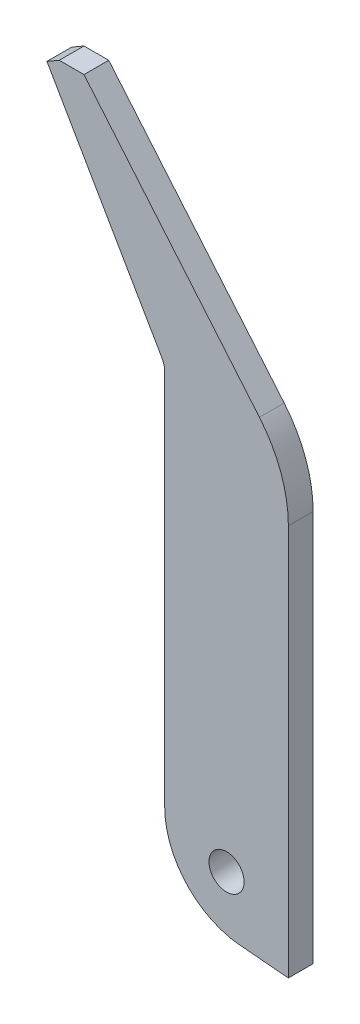
ISO-10303-21;
HEADER;
FILE_DESCRIPTION(('STEP AP214'),'2;1');
FILE_NAME('part.step','',(''),(''),'','','');
FILE_SCHEMA(('AUTOMOTIVE_DESIGN { 1 0 10303 214 1 1 1 1 }'));
ENDSEC;
DATA;
#1=APPLICATION_CONTEXT('core data for automotive mechanical design processes');
#2=APPLICATION_PROTOCOL_DEFINITION('international standard','automotive_design',2000,#1);
#3=PRODUCT_CONTEXT('',#1,'mechanical');
#4=PRODUCT('Part','Part','',(#3));
#5=PRODUCT_RELATED_PRODUCT_CATEGORY('part','',(#4));
#6=PRODUCT_DEFINITION_FORMATION('','',#4);
#7=PRODUCT_DEFINITION_CONTEXT('part definition',#1,'design');
#8=PRODUCT_DEFINITION('design','',#6,#7);
#9=PRODUCT_DEFINITION_SHAPE('','',#8);
#10=(LENGTH_UNIT() NAMED_UNIT(*) SI_UNIT(.MILLI.,.METRE.));
#11=(NAMED_UNIT(*) PLANE_ANGLE_UNIT() SI_UNIT($,.RADIAN.));
#12=(NAMED_UNIT(*) SI_UNIT($,.STERADIAN.) SOLID_ANGLE_UNIT());
#13=UNCERTAINTY_MEASURE_WITH_UNIT(LENGTH_MEASURE(1.E-05),#10,'distance_accuracy_value','');
#14=(GEOMETRIC_REPRESENTATION_CONTEXT(3) GLOBAL_UNCERTAINTY_ASSIGNED_CONTEXT((#13)) GLOBAL_UNIT_ASSIGNED_CONTEXT((#10,
#11,#12)) REPRESENTATION_CONTEXT('',''));
#15=CARTESIAN_POINT('',(0.,0.,0.));
#16=DIRECTION('',(0.,0.,1.));
#17=DIRECTION('',(1.,0.,0.));
#18=AXIS2_PLACEMENT_3D('',#15,#16,#17);
#19=CARTESIAN_POINT('',(-30.,95.,3.));
#20=DIRECTION('',(0.,0.,1.));
#21=DIRECTION('',(1.,0.,0.));
#22=AXIS2_PLACEMENT_3D('',#19,#20,#21);
#23=PLANE('',#22);
#24=DIRECTION('',(0.,-1.,0.));
#25=VECTOR('',#24,1.);
#26=CARTESIAN_POINT('',(-30.,112.43527488619,3.));
#27=LINE('',#26,#25);
#28=CARTESIAN_POINT('',(-30.,112.43527488619,3.));
#29=VERTEX_POINT('',#28);
#30=CARTESIAN_POINT('',(-30.,20.9512833861262,3.));
#31=VERTEX_POINT('',#30);
#32=EDGE_CURVE('E158',#29,#31,#27,.T.);
#33=ORIENTED_EDGE('',*,*,#32,.T.);
#34=CARTESIAN_POINT('',(-9.99999999999999,20.9512833861262,3.));
#35=DIRECTION('',(0.,0.,1.));
#36=DIRECTION('',(1.,0.,0.));
#37=AXIS2_PLACEMENT_3D('',#34,#35,#36);
#38=CIRCLE('',#37,20.);
#39=CARTESIAN_POINT('',(-11.7431148549532,1.02738942429131,3.));
#40=VERTEX_POINT('',#39);
#41=EDGE_CURVE('E11',#31,#40,#38,.T.);
#42=ORIENTED_EDGE('',*,*,#41,.T.);
#43=DIRECTION('',(0.996194698091745,-0.087155742747662,0.));
#44=VECTOR('',#43,1.);
#45=CARTESIAN_POINT('',(-30.,2.62465990577784,3.));
#46=LINE('',#45,#44);
#47=CARTESIAN_POINT('',(0.,0.,3.));
#48=VERTEX_POINT('',#47);
#49=EDGE_CURVE('E110',#40,#48,#46,.T.);
#50=ORIENTED_EDGE('',*,*,#49,.T.);
#51=DIRECTION('',(0.,1.,0.));
#52=VECTOR('',#51,1.);
#53=CARTESIAN_POINT('',(0.,0.,3.));
#54=LINE('',#53,#52);
#55=CARTESIAN_POINT('',(0.,95.,3.));
#56=VERTEX_POINT('',#55);
#57=EDGE_CURVE('E113',#48,#56,#54,.T.);
#58=ORIENTED_EDGE('',*,*,#57,.T.);
#59=CARTESIAN_POINT('',(-30.,95.,3.));
#60=DIRECTION('',(0.,0.,1.));
#61=DIRECTION('',(1.,0.,0.));
#62=AXIS2_PLACEMENT_3D('',#59,#60,#61);
#63=CIRCLE('',#62,30.);
#64=CARTESIAN_POINT('',(-7.0186667064307,114.283628290596,3.));
#65=VERTEX_POINT('',#64);
#66=EDGE_CURVE('E129',#56,#65,#63,.T.);
#67=ORIENTED_EDGE('',*,*,#66,.T.);
#68=DIRECTION('',(-0.642787609686541,0.766044443118977,0.));
#69=VECTOR('',#68,1.);
#70=CARTESIAN_POINT('',(-7.0186667064307,114.283628290596,3.));
#71=LINE('',#70,#69);
#72=CARTESIAN_POINT('',(-49.5747555024414,165.,3.));
#73=VERTEX_POINT('',#72);
#74=EDGE_CURVE('E185',#65,#73,#71,.T.);
#75=ORIENTED_EDGE('',*,*,#74,.T.);
#76=DIRECTION('',(-1.,0.,0.));
#77=VECTOR('',#76,1.);
#78=CARTESIAN_POINT('',(-49.5747555024414,165.,3.));
#79=LINE('',#78,#77);
#80=CARTESIAN_POINT('',(-55.5747555024414,165.,3.));
#81=VERTEX_POINT('',#80);
#82=EDGE_CURVE('E183',#73,#81,#79,.T.);
#83=ORIENTED_EDGE('',*,*,#82,.T.);
#84=DIRECTION('',(-0.866025403784429,-0.500000000000017,0.));
#85=VECTOR('',#84,1.);
#86=CARTESIAN_POINT('',(-55.5747555024414,165.,3.));
#87=LINE('',#86,#85);
#88=CARTESIAN_POINT('',(-58.5747555024414,163.267949192431,3.));
#89=VERTEX_POINT('',#88);
#90=EDGE_CURVE('E181',#81,#89,#87,.T.);
#91=ORIENTED_EDGE('',*,*,#90,.T.);
#92=DIRECTION('',(0.500000000000008,-0.866025403784434,0.));
#93=VECTOR('',#92,1.);
#94=CARTESIAN_POINT('',(-58.5747555024414,163.267949192431,3.));
#95=LINE('',#94,#93);
#96=CARTESIAN_POINT('',(-30.6698729810778,114.93527488619,3.));
#97=VERTEX_POINT('',#96);
#98=EDGE_CURVE('E179',#89,#97,#95,.T.);
#99=ORIENTED_EDGE('',*,*,#98,.T.);
#100=CARTESIAN_POINT('',(-35.,112.43527488619,3.));
#101=DIRECTION('',(0.,0.,-1.));
#102=DIRECTION('',(-1.,0.,0.));
#103=AXIS2_PLACEMENT_3D('',#100,#101,#102);
#104=CIRCLE('',#103,5.);
#105=EDGE_CURVE('E177',#97,#29,#104,.T.);
#106=ORIENTED_EDGE('',*,*,#105,.T.);
#107=EDGE_LOOP('',(#33,#42,#50,#58,#67,#75,#83,#91,#99,#106));
#108=FACE_BOUND('',#107,.T.);
#109=CARTESIAN_POINT('',(-15.,14.8,3.));
#110=DIRECTION('',(0.,0.,1.));
#111=DIRECTION('',(1.,0.,0.));
#112=AXIS2_PLACEMENT_3D('',#109,#110,#111);
#113=CIRCLE('',#112,4.25);
#114=CARTESIAN_POINT('',(-19.25,14.8,3.));
#115=VERTEX_POINT('',#114);
#116=EDGE_CURVE('E175',#115,#115,#113,.T.);
#117=ORIENTED_EDGE('',*,*,#116,.F.);
#118=EDGE_LOOP('',(#117));
#119=FACE_BOUND('',#118,.T.);
#120=ADVANCED_FACE('F34',(#108,#119),#23,.T.);
#121=CARTESIAN_POINT('',(-30.,95.,-3.));
#122=DIRECTION('',(0.,0.,1.));
#123=DIRECTION('',(1.,0.,0.));
#124=AXIS2_PLACEMENT_3D('',#121,#122,#123);
#125=PLANE('',#124);
#126=DIRECTION('',(0.996194698091745,-0.087155742747662,0.));
#127=VECTOR('',#126,1.);
#128=CARTESIAN_POINT('',(-30.,2.62465990577784,-3.));
#129=LINE('',#128,#127);
#130=CARTESIAN_POINT('',(-11.7431148549532,1.02738942429131,-3.));
#131=VERTEX_POINT('',#130);
#132=CARTESIAN_POINT('',(0.,0.,-3.));
#133=VERTEX_POINT('',#132);
#134=EDGE_CURVE('E132',#131,#133,#129,.T.);
#135=ORIENTED_EDGE('',*,*,#134,.F.);
#136=CARTESIAN_POINT('',(-9.99999999999999,20.9512833861262,-3.));
#137=DIRECTION('',(0.,0.,1.));
#138=DIRECTION('',(1.,0.,0.));
#139=AXIS2_PLACEMENT_3D('',#136,#137,#138);
#140=CIRCLE('',#139,20.);
#141=CARTESIAN_POINT('',(-30.,20.9512833861262,-3.));
#142=VERTEX_POINT('',#141);
#143=EDGE_CURVE('E56',#131,#142,#140,.F.);
#144=ORIENTED_EDGE('',*,*,#143,.T.);
#145=DIRECTION('',(0.,-1.,0.));
#146=VECTOR('',#145,1.);
#147=CARTESIAN_POINT('',(-30.,112.43527488619,-3.));
#148=LINE('',#147,#146);
#149=CARTESIAN_POINT('',(-30.,112.43527488619,-3.));
#150=VERTEX_POINT('',#149);
#151=EDGE_CURVE('E120',#150,#142,#148,.T.);
#152=ORIENTED_EDGE('',*,*,#151,.F.);
#153=CARTESIAN_POINT('',(-35.,112.43527488619,-3.));
#154=DIRECTION('',(0.,0.,-1.));
#155=DIRECTION('',(-1.,0.,0.));
#156=AXIS2_PLACEMENT_3D('',#153,#154,#155);
#157=CIRCLE('',#156,5.);
#158=CARTESIAN_POINT('',(-30.6698729810778,114.93527488619,-3.));
#159=VERTEX_POINT('',#158);
#160=EDGE_CURVE('E160',#159,#150,#157,.T.);
#161=ORIENTED_EDGE('',*,*,#160,.F.);
#162=DIRECTION('',(0.500000000000008,-0.866025403784434,0.));
#163=VECTOR('',#162,1.);
#164=CARTESIAN_POINT('',(-58.5747555024414,163.267949192431,-3.));
#165=LINE('',#164,#163);
#166=CARTESIAN_POINT('',(-58.5747555024414,163.267949192431,-3.));
#167=VERTEX_POINT('',#166);
#168=EDGE_CURVE('E162',#167,#159,#165,.T.);
#169=ORIENTED_EDGE('',*,*,#168,.F.);
#170=DIRECTION('',(-0.866025403784429,-0.500000000000017,0.));
#171=VECTOR('',#170,1.);
#172=CARTESIAN_POINT('',(-55.5747555024414,165.,-3.));
#173=LINE('',#172,#171);
#174=CARTESIAN_POINT('',(-55.5747555024414,165.,-3.));
#175=VERTEX_POINT('',#174);
#176=EDGE_CURVE('E164',#175,#167,#173,.T.);
#177=ORIENTED_EDGE('',*,*,#176,.F.);
#178=DIRECTION('',(-1.,0.,0.));
#179=VECTOR('',#178,1.);
#180=CARTESIAN_POINT('',(-49.5747555024414,165.,-3.));
#181=LINE('',#180,#179);
#182=CARTESIAN_POINT('',(-49.5747555024414,165.,-3.));
#183=VERTEX_POINT('',#182);
#184=EDGE_CURVE('E166',#183,#175,#181,.T.);
#185=ORIENTED_EDGE('',*,*,#184,.F.);
#186=DIRECTION('',(-0.642787609686541,0.766044443118977,0.));
#187=VECTOR('',#186,1.);
#188=CARTESIAN_POINT('',(-7.0186667064307,114.283628290596,-3.));
#189=LINE('',#188,#187);
#190=CARTESIAN_POINT('',(-7.0186667064307,114.283628290596,-3.));
#191=VERTEX_POINT('',#190);
#192=EDGE_CURVE('E168',#191,#183,#189,.T.);
#193=ORIENTED_EDGE('',*,*,#192,.F.);
#194=CARTESIAN_POINT('',(-30.,95.,-3.));
#195=DIRECTION('',(0.,0.,1.));
#196=DIRECTION('',(1.,0.,0.));
#197=AXIS2_PLACEMENT_3D('',#194,#195,#196);
#198=CIRCLE('',#197,30.);
#199=CARTESIAN_POINT('',(0.,95.,-3.));
#200=VERTEX_POINT('',#199);
#201=EDGE_CURVE('E170',#200,#191,#198,.T.);
#202=ORIENTED_EDGE('',*,*,#201,.F.);
#203=DIRECTION('',(0.,1.,0.));
#204=VECTOR('',#203,1.);
#205=CARTESIAN_POINT('',(0.,0.,-3.));
#206=LINE('',#205,#204);
#207=EDGE_CURVE('E172',#133,#200,#206,.T.);
#208=ORIENTED_EDGE('',*,*,#207,.F.);
#209=EDGE_LOOP('',(#135,#144,#152,#161,#169,#177,#185,#193,#202,#208));
#210=FACE_BOUND('',#209,.T.);
#211=CARTESIAN_POINT('',(-15.,14.8,-3.));
#212=DIRECTION('',(0.,0.,1.));
#213=DIRECTION('',(1.,0.,0.));
#214=AXIS2_PLACEMENT_3D('',#211,#212,#213);
#215=CIRCLE('',#214,4.25);
#216=CARTESIAN_POINT('',(-19.25,14.8,-3.));
#217=VERTEX_POINT('',#216);
#218=EDGE_CURVE('E188',#217,#217,#215,.T.);
#219=ORIENTED_EDGE('',*,*,#218,.T.);
#220=EDGE_LOOP('',(#219));
#221=FACE_BOUND('',#220,.T.);
#222=ADVANCED_FACE('F197',(#210,#221),#125,.F.);
#223=CARTESIAN_POINT('',(-30.,2.62465990577784,3.));
#224=DIRECTION('',(0.087155742747662,0.996194698091745,0.));
#225=DIRECTION('',(-0.996194698091745,0.087155742747662,0.));
#226=AXIS2_PLACEMENT_3D('',#223,#224,#225);
#227=PLANE('',#226);
#228=ORIENTED_EDGE('',*,*,#49,.F.);
#229=DIRECTION('',(0.,0.,-1.));
#230=VECTOR('',#229,1.);
#231=CARTESIAN_POINT('',(-11.7431148549532,1.02738942429131,3.));
#232=LINE('',#231,#230);
#233=EDGE_CURVE('E134',#40,#131,#232,.T.);
#234=ORIENTED_EDGE('',*,*,#233,.T.);
#235=ORIENTED_EDGE('',*,*,#134,.T.);
#236=DIRECTION('',(0.,0.,-1.));
#237=VECTOR('',#236,1.);
#238=CARTESIAN_POINT('',(0.,0.,3.));
#239=LINE('',#238,#237);
#240=EDGE_CURVE('E125',#48,#133,#239,.T.);
#241=ORIENTED_EDGE('',*,*,#240,.F.);
#242=EDGE_LOOP('',(#228,#234,#235,#241));
#243=FACE_BOUND('',#242,.T.);
#244=ADVANCED_FACE('F131',(#243),#227,.F.);
#245=CARTESIAN_POINT('',(0.,0.,3.));
#246=DIRECTION('',(-1.,0.,0.));
#247=DIRECTION('',(0.,0.,1.));
#248=AXIS2_PLACEMENT_3D('',#245,#246,#247);
#249=PLANE('',#248);
#250=ORIENTED_EDGE('',*,*,#207,.T.);
#251=DIRECTION('',(0.,0.,-1.));
#252=VECTOR('',#251,1.);
#253=CARTESIAN_POINT('',(0.,95.,3.));
#254=LINE('',#253,#252);
#255=EDGE_CURVE('E127',#56,#200,#254,.T.);
#256=ORIENTED_EDGE('',*,*,#255,.F.);
#257=ORIENTED_EDGE('',*,*,#57,.F.);
#258=ORIENTED_EDGE('',*,*,#240,.T.);
#259=EDGE_LOOP('',(#250,#256,#257,#258));
#260=FACE_BOUND('',#259,.T.);
#261=ADVANCED_FACE('F124',(#260),#249,.F.);
#262=CARTESIAN_POINT('',(-30.,95.,3.));
#263=DIRECTION('',(0.,0.,-1.));
#264=DIRECTION('',(-1.,0.,0.));
#265=AXIS2_PLACEMENT_3D('',#262,#263,#264);
#266=CYLINDRICAL_SURFACE('',#265,30.);
#267=ORIENTED_EDGE('',*,*,#201,.T.);
#268=DIRECTION('',(0.,0.,-1.));
#269=VECTOR('',#268,1.);
#270=CARTESIAN_POINT('',(-7.0186667064307,114.283628290596,3.));
#271=LINE('',#270,#269);
#272=EDGE_CURVE('E137',#65,#191,#271,.T.);
#273=ORIENTED_EDGE('',*,*,#272,.F.);
#274=ORIENTED_EDGE('',*,*,#66,.F.);
#275=ORIENTED_EDGE('',*,*,#255,.T.);
#276=EDGE_LOOP('',(#267,#273,#274,#275));
#277=FACE_BOUND('',#276,.T.);
#278=ADVANCED_FACE('F227',(#277),#266,.T.);
#279=CARTESIAN_POINT('',(-7.0186667064307,114.283628290596,3.));
#280=DIRECTION('',(-0.766044443118977,-0.642787609686541,0.));
#281=DIRECTION('',(0.642787609686541,-0.766044443118977,0.));
#282=AXIS2_PLACEMENT_3D('',#279,#280,#281);
#283=PLANE('',#282);
#284=ORIENTED_EDGE('',*,*,#192,.T.);
#285=DIRECTION('',(0.,0.,-1.));
#286=VECTOR('',#285,1.);
#287=CARTESIAN_POINT('',(-49.5747555024414,165.,3.));
#288=LINE('',#287,#286);
#289=EDGE_CURVE('E143',#73,#183,#288,.T.);
#290=ORIENTED_EDGE('',*,*,#289,.F.);
#291=ORIENTED_EDGE('',*,*,#74,.F.);
#292=ORIENTED_EDGE('',*,*,#272,.T.);
#293=EDGE_LOOP('',(#284,#290,#291,#292));
#294=FACE_BOUND('',#293,.T.);
#295=ADVANCED_FACE('F223',(#294),#283,.F.);
#296=CARTESIAN_POINT('',(-49.5747555024414,165.,3.));
#297=DIRECTION('',(0.,-1.,0.));
#298=DIRECTION('',(0.,0.,-1.));
#299=AXIS2_PLACEMENT_3D('',#296,#297,#298);
#300=PLANE('',#299);
#301=ORIENTED_EDGE('',*,*,#184,.T.);
#302=DIRECTION('',(0.,0.,-1.));
#303=VECTOR('',#302,1.);
#304=CARTESIAN_POINT('',(-55.5747555024414,165.,3.));
#305=LINE('',#304,#303);
#306=EDGE_CURVE('E146',#81,#175,#305,.T.);
#307=ORIENTED_EDGE('',*,*,#306,.F.);
#308=ORIENTED_EDGE('',*,*,#82,.F.);
#309=ORIENTED_EDGE('',*,*,#289,.T.);
#310=EDGE_LOOP('',(#301,#307,#308,#309));
#311=FACE_BOUND('',#310,.T.);
#312=ADVANCED_FACE('F219',(#311),#300,.F.);
#313=CARTESIAN_POINT('',(-55.5747555024414,165.,3.));
#314=DIRECTION('',(0.500000000000017,-0.866025403784429,0.));
#315=DIRECTION('',(0.866025403784429,0.500000000000017,0.));
#316=AXIS2_PLACEMENT_3D('',#313,#314,#315);
#317=PLANE('',#316);
#318=ORIENTED_EDGE('',*,*,#176,.T.);
#319=DIRECTION('',(0.,0.,-1.));
#320=VECTOR('',#319,1.);
#321=CARTESIAN_POINT('',(-58.5747555024414,163.267949192431,3.));
#322=LINE('',#321,#320);
#323=EDGE_CURVE('E149',#89,#167,#322,.T.);
#324=ORIENTED_EDGE('',*,*,#323,.F.);
#325=ORIENTED_EDGE('',*,*,#90,.F.);
#326=ORIENTED_EDGE('',*,*,#306,.T.);
#327=EDGE_LOOP('',(#318,#324,#325,#326));
#328=FACE_BOUND('',#327,.T.);
#329=ADVANCED_FACE('F215',(#328),#317,.F.);
#330=CARTESIAN_POINT('',(-58.5747555024414,163.267949192431,3.));
#331=DIRECTION('',(0.866025403784434,0.500000000000008,0.));
#332=DIRECTION('',(-0.500000000000008,0.866025403784434,0.));
#333=AXIS2_PLACEMENT_3D('',#330,#331,#332);
#334=PLANE('',#333);
#335=ORIENTED_EDGE('',*,*,#168,.T.);
#336=DIRECTION('',(0.,0.,-1.));
#337=VECTOR('',#336,1.);
#338=CARTESIAN_POINT('',(-30.6698729810778,114.93527488619,3.));
#339=LINE('',#338,#337);
#340=EDGE_CURVE('E152',#97,#159,#339,.T.);
#341=ORIENTED_EDGE('',*,*,#340,.F.);
#342=ORIENTED_EDGE('',*,*,#98,.F.);
#343=ORIENTED_EDGE('',*,*,#323,.T.);
#344=EDGE_LOOP('',(#335,#341,#342,#343));
#345=FACE_BOUND('',#344,.T.);
#346=ADVANCED_FACE('F211',(#345),#334,.F.);
#347=CARTESIAN_POINT('',(-35.,112.43527488619,3.));
#348=DIRECTION('',(0.,0.,-1.));
#349=DIRECTION('',(-1.,0.,0.));
#350=AXIS2_PLACEMENT_3D('',#347,#348,#349);
#351=CYLINDRICAL_SURFACE('',#350,5.);
#352=ORIENTED_EDGE('',*,*,#160,.T.);
#353=DIRECTION('',(0.,0.,-1.));
#354=VECTOR('',#353,1.);
#355=CARTESIAN_POINT('',(-30.,112.43527488619,3.));
#356=LINE('',#355,#354);
#357=EDGE_CURVE('E155',#29,#150,#356,.T.);
#358=ORIENTED_EDGE('',*,*,#357,.F.);
#359=ORIENTED_EDGE('',*,*,#105,.F.);
#360=ORIENTED_EDGE('',*,*,#340,.T.);
#361=EDGE_LOOP('',(#352,#358,#359,#360));
#362=FACE_BOUND('',#361,.T.);
#363=ADVANCED_FACE('F208',(#362),#351,.F.);
#364=CARTESIAN_POINT('',(-30.,112.43527488619,3.));
#365=DIRECTION('',(1.,0.,0.));
#366=DIRECTION('',(0.,1.,0.));
#367=AXIS2_PLACEMENT_3D('',#364,#365,#366);
#368=PLANE('',#367);
#369=ORIENTED_EDGE('',*,*,#151,.T.);
#370=DIRECTION('',(0.,0.,-1.));
#371=VECTOR('',#370,1.);
#372=CARTESIAN_POINT('',(-30.,20.9512833861262,3.));
#373=LINE('',#372,#371);
#374=EDGE_CURVE('E42',#142,#31,#373,.F.);
#375=ORIENTED_EDGE('',*,*,#374,.T.);
#376=ORIENTED_EDGE('',*,*,#32,.F.);
#377=ORIENTED_EDGE('',*,*,#357,.T.);
#378=EDGE_LOOP('',(#369,#375,#376,#377));
#379=FACE_BOUND('',#378,.T.);
#380=ADVANCED_FACE('F205',(#379),#368,.F.);
#381=CARTESIAN_POINT('',(-15.,14.8,3.));
#382=DIRECTION('',(0.,0.,-1.));
#383=DIRECTION('',(-1.,0.,0.));
#384=AXIS2_PLACEMENT_3D('',#381,#382,#383);
#385=CYLINDRICAL_SURFACE('',#384,4.25);
#386=CARTESIAN_POINT('',(-19.25,14.8,3.));
#387=CARTESIAN_POINT('',(-19.25,14.8,2.9375));
#388=CARTESIAN_POINT('',(-19.25,14.8,2.875));
#389=CARTESIAN_POINT('',(-19.25,14.8,2.75));
#390=CARTESIAN_POINT('',(-19.25,14.8,2.6875));
#391=CARTESIAN_POINT('',(-19.25,14.8,2.5625));
#392=CARTESIAN_POINT('',(-19.25,14.8,2.5));
#393=CARTESIAN_POINT('',(-19.25,14.8,2.375));
#394=CARTESIAN_POINT('',(-19.25,14.8,2.3125));
#395=CARTESIAN_POINT('',(-19.25,14.8,2.1875));
#396=CARTESIAN_POINT('',(-19.25,14.8,2.125));
#397=CARTESIAN_POINT('',(-19.25,14.8,2.));
#398=CARTESIAN_POINT('',(-19.25,14.8,1.9375));
#399=CARTESIAN_POINT('',(-19.25,14.8,1.8125));
#400=CARTESIAN_POINT('',(-19.25,14.8,1.75));
#401=CARTESIAN_POINT('',(-19.25,14.8,1.625));
#402=CARTESIAN_POINT('',(-19.25,14.8,1.5625));
#403=CARTESIAN_POINT('',(-19.25,14.8,1.4375));
#404=CARTESIAN_POINT('',(-19.25,14.8,1.375));
#405=CARTESIAN_POINT('',(-19.25,14.8,1.25));
#406=CARTESIAN_POINT('',(-19.25,14.8,1.1875));
#407=CARTESIAN_POINT('',(-19.25,14.8,1.0625));
#408=CARTESIAN_POINT('',(-19.25,14.8,0.999999999999999));
#409=CARTESIAN_POINT('',(-19.25,14.8,0.874999999999999));
#410=CARTESIAN_POINT('',(-19.25,14.8,0.812499999999999));
#411=CARTESIAN_POINT('',(-19.25,14.8,0.687499999999999));
#412=CARTESIAN_POINT('',(-19.25,14.8,0.624999999999999));
#413=CARTESIAN_POINT('',(-19.25,14.8,0.499999999999999));
#414=CARTESIAN_POINT('',(-19.25,14.8,0.437499999999999));
#415=CARTESIAN_POINT('',(-19.25,14.8,0.312499999999999));
#416=CARTESIAN_POINT('',(-19.25,14.8,0.249999999999999));
#417=CARTESIAN_POINT('',(-19.25,14.8,0.124999999999999));
#418=CARTESIAN_POINT('',(-19.25,14.8,0.0624999999999992));
#419=CARTESIAN_POINT('',(-19.25,14.8,-0.0625000000000009));
#420=CARTESIAN_POINT('',(-19.25,14.8,-0.125000000000001));
#421=CARTESIAN_POINT('',(-19.25,14.8,-0.250000000000001));
#422=CARTESIAN_POINT('',(-19.25,14.8,-0.312500000000001));
#423=CARTESIAN_POINT('',(-19.25,14.8,-0.437500000000001));
#424=CARTESIAN_POINT('',(-19.25,14.8,-0.500000000000001));
#425=CARTESIAN_POINT('',(-19.25,14.8,-0.625));
#426=CARTESIAN_POINT('',(-19.25,14.8,-0.6875));
#427=CARTESIAN_POINT('',(-19.25,14.8,-0.8125));
#428=CARTESIAN_POINT('',(-19.25,14.8,-0.875));
#429=CARTESIAN_POINT('',(-19.25,14.8,-1.));
#430=CARTESIAN_POINT('',(-19.25,14.8,-1.0625));
#431=CARTESIAN_POINT('',(-19.25,14.8,-1.1875));
#432=CARTESIAN_POINT('',(-19.25,14.8,-1.25));
#433=CARTESIAN_POINT('',(-19.25,14.8,-1.375));
#434=CARTESIAN_POINT('',(-19.25,14.8,-1.4375));
#435=CARTESIAN_POINT('',(-19.25,14.8,-1.5625));
#436=CARTESIAN_POINT('',(-19.25,14.8,-1.625));
#437=CARTESIAN_POINT('',(-19.25,14.8,-1.75));
#438=CARTESIAN_POINT('',(-19.25,14.8,-1.8125));
#439=CARTESIAN_POINT('',(-19.25,14.8,-1.9375));
#440=CARTESIAN_POINT('',(-19.25,14.8,-2.));
#441=CARTESIAN_POINT('',(-19.25,14.8,-2.125));
#442=CARTESIAN_POINT('',(-19.25,14.8,-2.1875));
#443=CARTESIAN_POINT('',(-19.25,14.8,-2.3125));
#444=CARTESIAN_POINT('',(-19.25,14.8,-2.375));
#445=CARTESIAN_POINT('',(-19.25,14.8,-2.5));
#446=CARTESIAN_POINT('',(-19.25,14.8,-2.5625));
#447=CARTESIAN_POINT('',(-19.25,14.8,-2.6875));
#448=CARTESIAN_POINT('',(-19.25,14.8,-2.75));
#449=CARTESIAN_POINT('',(-19.25,14.8,-2.875));
#450=CARTESIAN_POINT('',(-19.25,14.8,-2.9375));
#451=CARTESIAN_POINT('',(-19.25,14.8,-3.));
#452=B_SPLINE_CURVE_WITH_KNOTS('',3,(#386,#387,#388,#389,#390,#391,#392,#393,#394,#395,#396,
#397,#398,#399,#400,#401,#402,#403,#404,#405,#406,#407,#408,#409,#410,#411,#412,#413,#414,#415,
#416,#417,#418,#419,#420,#421,#422,#423,#424,#425,#426,#427,#428,#429,#430,#431,#432,#433,#434,
#435,#436,#437,#438,#439,#440,#441,#442,#443,#444,#445,#446,#447,#448,#449,#450,#451),
.UNSPECIFIED.,.F.,.F.,(4,2,2,2,2,2,2,2,2,2,2,2,2,2,2,2,2,2,2,2,2,2,2,2,2,2,2,2,2,2,2,2,4),(0.,
0.1875,0.374999999999999,0.5625,0.749999999999999,0.9375,1.125,1.3125,1.5,1.6875,1.875,2.0625,
2.25,2.4375,2.625,2.8125,3.,3.1875,3.375,3.5625,3.75,3.9375,4.125,4.3125,4.5,4.6875,4.875,
5.0625,5.25,5.4375,5.625,5.8125,6.),.UNSPECIFIED.);
#453=EDGE_CURVE('BSEAM194',#115,#217,#452,.T.);
#454=ORIENTED_EDGE('',*,*,#116,.T.);
#455=ORIENTED_EDGE('',*,*,#218,.F.);
#456=ORIENTED_EDGE('',*,*,#453,.T.);
#457=ORIENTED_EDGE('',*,*,#453,.F.);
#458=EDGE_LOOP('',(#454,#456,#455,#457));
#459=FACE_BOUND('',#458,.T.);
#460=ADVANCED_FACE('F194',(#459),#385,.F.);
#461=CARTESIAN_POINT('',(-9.99999999999999,20.9512833861262,3.));
#462=DIRECTION('',(0.,0.,-1.));
#463=DIRECTION('',(-1.,0.,0.));
#464=AXIS2_PLACEMENT_3D('',#461,#462,#463);
#465=CYLINDRICAL_SURFACE('',#464,20.);
#466=ORIENTED_EDGE('',*,*,#41,.F.);
#467=ORIENTED_EDGE('',*,*,#374,.F.);
#468=ORIENTED_EDGE('',*,*,#143,.F.);
#469=ORIENTED_EDGE('',*,*,#233,.F.);
#470=EDGE_LOOP('',(#466,#467,#468,#469));
#471=FACE_BOUND('',#470,.T.);
#472=ADVANCED_FACE('F36',(#471),#465,.T.);
#473=CLOSED_SHELL('',(#120,#222,#244,#261,#278,#295,#312,#329,#346,#363,#380,#460,#472));
#474=MANIFOLD_SOLID_BREP('B2',#473);
#475=ADVANCED_BREP_SHAPE_REPRESENTATION('',(#18,#474),#14);
#476=SHAPE_DEFINITION_REPRESENTATION(#9,#475);
ENDSEC;
END-ISO-10303-21;
